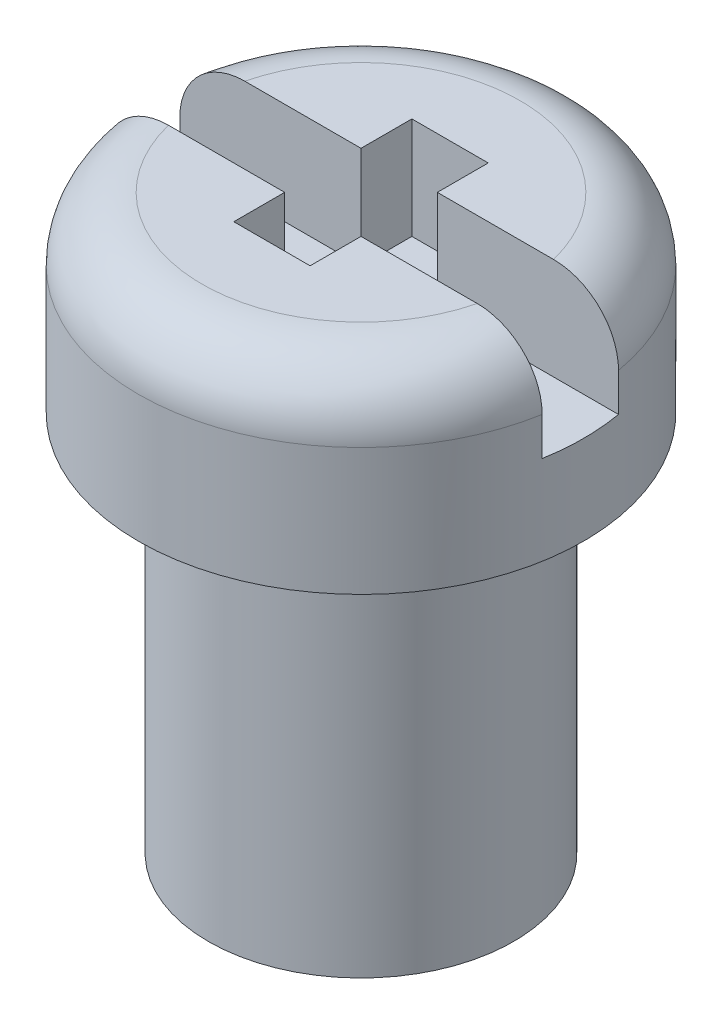
ISO-10303-21;
HEADER;
FILE_DESCRIPTION(('STEP AP214'),'2;1');
FILE_NAME('part.step','',(''),(''),'','','');
FILE_SCHEMA(('AUTOMOTIVE_DESIGN { 1 0 10303 214 1 1 1 1 }'));
ENDSEC;
DATA;
#1=APPLICATION_CONTEXT('core data for automotive mechanical design processes');
#2=APPLICATION_PROTOCOL_DEFINITION('international standard','automotive_design',2000,#1);
#3=PRODUCT_CONTEXT('',#1,'mechanical');
#4=PRODUCT('Part','Part','',(#3));
#5=PRODUCT_RELATED_PRODUCT_CATEGORY('part','',(#4));
#6=PRODUCT_DEFINITION_FORMATION('','',#4);
#7=PRODUCT_DEFINITION_CONTEXT('part definition',#1,'design');
#8=PRODUCT_DEFINITION('design','',#6,#7);
#9=PRODUCT_DEFINITION_SHAPE('','',#8);
#10=(LENGTH_UNIT() NAMED_UNIT(*) SI_UNIT(.MILLI.,.METRE.));
#11=(NAMED_UNIT(*) PLANE_ANGLE_UNIT() SI_UNIT($,.RADIAN.));
#12=(NAMED_UNIT(*) SI_UNIT($,.STERADIAN.) SOLID_ANGLE_UNIT());
#13=UNCERTAINTY_MEASURE_WITH_UNIT(LENGTH_MEASURE(1.E-05),#10,'distance_accuracy_value','');
#14=(GEOMETRIC_REPRESENTATION_CONTEXT(3) GLOBAL_UNCERTAINTY_ASSIGNED_CONTEXT((#13)) GLOBAL_UNIT_ASSIGNED_CONTEXT((#10,
#11,#12)) REPRESENTATION_CONTEXT('',''));
#15=CARTESIAN_POINT('',(0.,0.,0.));
#16=DIRECTION('',(0.,0.,1.));
#17=DIRECTION('',(1.,0.,0.));
#18=AXIS2_PLACEMENT_3D('',#15,#16,#17);
#19=CARTESIAN_POINT('',(11.435,15.43857864376,-7.956));
#20=DIRECTION('',(0.,1.,0.));
#21=DIRECTION('',(0.,0.,1.));
#22=AXIS2_PLACEMENT_3D('',#19,#20,#21);
#23=PLANE('',#22);
#24=DIRECTION('',(-1.,0.,0.));
#25=VECTOR('',#24,1.);
#26=CARTESIAN_POINT('',(13.050906035045,15.43857864376,-7.1));
#27=LINE('',#26,#25);
#28=CARTESIAN_POINT('',(14.475,15.43857864376,-7.09999999999997));
#29=VERTEX_POINT('',#28);
#30=CARTESIAN_POINT('',(11.6268120700878,15.43857864376,-7.1));
#31=VERTEX_POINT('',#30);
#32=EDGE_CURVE('E111',#29,#31,#27,.T.);
#33=ORIENTED_EDGE('',*,*,#32,.T.);
#34=CARTESIAN_POINT('',(15.075,15.43857864376,-6.5));
#35=DIRECTION('',(0.,1.,0.));
#36=DIRECTION('',(0.,0.,1.));
#37=AXIS2_PLACEMENT_3D('',#34,#35,#36);
#38=CIRCLE('',#37,3.5);
#39=CARTESIAN_POINT('',(11.6268120700874,15.43857864376,-5.9));
#40=VERTEX_POINT('',#39);
#41=EDGE_CURVE('E105',#31,#40,#38,.T.);
#42=ORIENTED_EDGE('',*,*,#41,.T.);
#43=DIRECTION('',(1.,0.,0.));
#44=VECTOR('',#43,1.);
#45=CARTESIAN_POINT('',(13.050906035045,15.43857864376,-5.9));
#46=LINE('',#45,#44);
#47=CARTESIAN_POINT('',(14.475,15.43857864376,-5.90000000000006));
#48=VERTEX_POINT('',#47);
#49=EDGE_CURVE('E108',#40,#48,#46,.T.);
#50=ORIENTED_EDGE('',*,*,#49,.T.);
#51=DIRECTION('',(0.,0.,1.));
#52=VECTOR('',#51,1.);
#53=CARTESIAN_POINT('',(14.475,15.43857864376,-5.5));
#54=LINE('',#53,#52);
#55=CARTESIAN_POINT('',(14.475,15.43857864376,-5.09999999999998));
#56=VERTEX_POINT('',#55);
#57=EDGE_CURVE('E152',#48,#56,#54,.T.);
#58=ORIENTED_EDGE('',*,*,#57,.T.);
#59=DIRECTION('',(1.,0.,0.));
#60=VECTOR('',#59,1.);
#61=CARTESIAN_POINT('',(15.075,15.43857864376,-5.1));
#62=LINE('',#61,#60);
#63=CARTESIAN_POINT('',(15.675,15.43857864376,-5.09999999999997));
#64=VERTEX_POINT('',#63);
#65=EDGE_CURVE('E202',#56,#64,#62,.T.);
#66=ORIENTED_EDGE('',*,*,#65,.T.);
#67=DIRECTION('',(0.,0.,-1.));
#68=VECTOR('',#67,1.);
#69=CARTESIAN_POINT('',(15.675,15.43857864376,-5.5));
#70=LINE('',#69,#68);
#71=CARTESIAN_POINT('',(15.675,15.43857864376,-5.90000000000007));
#72=VERTEX_POINT('',#71);
#73=EDGE_CURVE('E191',#64,#72,#70,.T.);
#74=ORIENTED_EDGE('',*,*,#73,.T.);
#75=DIRECTION('',(1.,0.,0.));
#76=VECTOR('',#75,1.);
#77=CARTESIAN_POINT('',(17.099093964955,15.43857864376,-5.9));
#78=LINE('',#77,#76);
#79=CARTESIAN_POINT('',(18.5231879299122,15.43857864376,-5.9));
#80=VERTEX_POINT('',#79);
#81=EDGE_CURVE('E126',#72,#80,#78,.T.);
#82=ORIENTED_EDGE('',*,*,#81,.T.);
#83=CARTESIAN_POINT('',(15.075,15.43857864376,-6.5));
#84=DIRECTION('',(0.,1.,0.));
#85=DIRECTION('',(0.,0.,1.));
#86=AXIS2_PLACEMENT_3D('',#83,#84,#85);
#87=CIRCLE('',#86,3.5);
#88=CARTESIAN_POINT('',(18.5231879299125,15.43857864376,-7.1));
#89=VERTEX_POINT('',#88);
#90=EDGE_CURVE('E20',#80,#89,#87,.T.);
#91=ORIENTED_EDGE('',*,*,#90,.T.);
#92=DIRECTION('',(-1.,0.,0.));
#93=VECTOR('',#92,1.);
#94=CARTESIAN_POINT('',(17.099093964955,15.43857864376,-7.1));
#95=LINE('',#94,#93);
#96=CARTESIAN_POINT('',(15.675,15.43857864376,-7.09999999999996));
#97=VERTEX_POINT('',#96);
#98=EDGE_CURVE('E156',#89,#97,#95,.T.);
#99=ORIENTED_EDGE('',*,*,#98,.T.);
#100=DIRECTION('',(0.,0.,-1.));
#101=VECTOR('',#100,1.);
#102=CARTESIAN_POINT('',(15.675,15.43857864376,-6.5));
#103=LINE('',#102,#101);
#104=CARTESIAN_POINT('',(15.675,15.43857864376,-7.90000000000003));
#105=VERTEX_POINT('',#104);
#106=EDGE_CURVE('E173',#97,#105,#103,.T.);
#107=ORIENTED_EDGE('',*,*,#106,.T.);
#108=DIRECTION('',(-1.,0.,0.));
#109=VECTOR('',#108,1.);
#110=CARTESIAN_POINT('',(15.075,15.43857864376,-7.9));
#111=LINE('',#110,#109);
#112=CARTESIAN_POINT('',(14.475,15.43857864376,-7.9));
#113=VERTEX_POINT('',#112);
#114=EDGE_CURVE('E170',#105,#113,#111,.T.);
#115=ORIENTED_EDGE('',*,*,#114,.T.);
#116=DIRECTION('',(0.,0.,1.));
#117=VECTOR('',#116,1.);
#118=CARTESIAN_POINT('',(14.475,15.43857864376,-6.5));
#119=LINE('',#118,#117);
#120=EDGE_CURVE('E117',#113,#29,#119,.T.);
#121=ORIENTED_EDGE('',*,*,#120,.T.);
#122=EDGE_LOOP('',(#33,#42,#50,#58,#66,#74,#82,#91,#99,#107,#115,#121));
#123=FACE_BOUND('',#122,.T.);
#124=ADVANCED_FACE('F16',(#123),#23,.T.);
#125=CARTESIAN_POINT('',(11.56984831149,15.40657864376,-5.9));
#126=DIRECTION('',(0.,0.,1.));
#127=DIRECTION('',(1.,0.,0.));
#128=AXIS2_PLACEMENT_3D('',#125,#126,#127);
#129=PLANE('',#128);
#130=ORIENTED_EDGE('',*,*,#49,.F.);
#131=DIRECTION('',(0.,-1.,0.));
#132=VECTOR('',#131,1.);
#133=CARTESIAN_POINT('',(11.6268120700882,16.23857864376,-5.9));
#134=LINE('',#133,#132);
#135=CARTESIAN_POINT('',(11.6268120700874,16.03857864376,-5.9));
#136=VERTEX_POINT('',#135);
#137=EDGE_CURVE('E121',#136,#40,#134,.T.);
#138=ORIENTED_EDGE('',*,*,#137,.F.);
#139=CARTESIAN_POINT('',(12.6480677800963,17.03857864376,-5.9));
#140=CARTESIAN_POINT('',(12.5895420814691,17.0386230612065,-5.9));
#141=CARTESIAN_POINT('',(12.5310194945801,17.0337372969009,-5.9));
#142=CARTESIAN_POINT('',(12.415587216186,17.0143129306468,-5.9));
#143=CARTESIAN_POINT('',(12.3586778853953,16.9997721873794,-5.9));
#144=CARTESIAN_POINT('',(12.2480446087088,16.9612240955659,-5.9));
#145=CARTESIAN_POINT('',(12.1943242819711,16.9372062192238,-5.9));
#146=CARTESIAN_POINT('',(12.1174966689575,16.8945991982062,-5.9));
#147=CARTESIAN_POINT('',(12.0925142544198,16.8793012108076,-5.9));
#148=CARTESIAN_POINT('',(12.0439360789731,16.8465906645345,-5.9));
#149=CARTESIAN_POINT('',(12.0203417610094,16.8291759609934,-5.9));
#150=CARTESIAN_POINT('',(11.9528413828041,16.7746538367913,-5.9));
#151=CARTESIAN_POINT('',(11.9111879591809,16.7346948608543,-5.9));
#152=CARTESIAN_POINT('',(11.8353593452245,16.6482234521663,-5.9));
#153=CARTESIAN_POINT('',(11.80118282838,16.6017121842974,-5.9));
#154=CARTESIAN_POINT('',(11.7566170003668,16.5285557984295,-5.9));
#155=CARTESIAN_POINT('',(11.7429731499233,16.5038456545106,-5.9));
#156=CARTESIAN_POINT('',(11.7178484907949,16.4533789493139,-5.9));
#157=CARTESIAN_POINT('',(11.7063657965044,16.427623324297,-5.9));
#158=CARTESIAN_POINT('',(11.6752966977488,16.3490397649066,-5.9));
#159=CARTESIAN_POINT('',(11.6590505315232,16.2948314783461,-5.9));
#160=CARTESIAN_POINT('',(11.6406551642276,16.2066119912148,-5.9));
#161=CARTESIAN_POINT('',(11.6354666697964,16.1731930509288,-5.9));
#162=CARTESIAN_POINT('',(11.6285473052076,16.1060494764975,-5.9));
#163=CARTESIAN_POINT('',(11.6268112925914,16.0723253722789,-5.90000000000002));
#164=CARTESIAN_POINT('',(11.626812070084,16.03857864376,-5.90000000000004));
#165=B_SPLINE_CURVE_WITH_KNOTS('',3,(#139,#140,#141,#142,#143,#144,#145,#146,#147,#148,#149,
#150,#151,#152,#153,#154,#155,#156,#157,#158,#159,#160,#161,#162,#163,#164),.UNSPECIFIED.,.F.,
.F.,(4,2,2,2,2,2,2,2,2,2,2,2,4),(0.,0.175362882315274,0.350764670292272,0.526361856657457,
0.614150494019772,0.702028832546056,0.874296341847614,1.04653326357754,1.13112253781448,
1.21563766238174,1.3844471265291,1.4857490646109,1.58690000048813),.UNSPECIFIED.);
#166=CARTESIAN_POINT('',(12.6480677800963,17.03857864376,-5.8999999999999));
#167=VERTEX_POINT('',#166);
#168=EDGE_CURVE('E116',#167,#136,#165,.T.);
#169=ORIENTED_EDGE('',*,*,#168,.F.);
#170=DIRECTION('',(-1.,0.,0.));
#171=VECTOR('',#170,1.);
#172=CARTESIAN_POINT('',(15.075,17.03857864376,-5.9));
#173=LINE('',#172,#171);
#174=CARTESIAN_POINT('',(14.4749999999997,17.03857864376,-5.90000000000004));
#175=VERTEX_POINT('',#174);
#176=EDGE_CURVE('E226',#175,#167,#173,.T.);
#177=ORIENTED_EDGE('',*,*,#176,.F.);
#178=DIRECTION('',(0.,-1.,0.));
#179=VECTOR('',#178,1.);
#180=CARTESIAN_POINT('',(14.475,16.23857864376,-5.90000000000012));
#181=LINE('',#180,#179);
#182=EDGE_CURVE('E124',#175,#48,#181,.T.);
#183=ORIENTED_EDGE('',*,*,#182,.T.);
#184=EDGE_LOOP('',(#130,#138,#169,#177,#183));
#185=FACE_BOUND('',#184,.T.);
#186=ADVANCED_FACE('F120',(#185),#129,.F.);
#187=CARTESIAN_POINT('',(15.6180362414,15.40657864376,-5.9));
#188=DIRECTION('',(0.,0.,1.));
#189=DIRECTION('',(1.,0.,0.));
#190=AXIS2_PLACEMENT_3D('',#187,#188,#189);
#191=PLANE('',#190);
#192=DIRECTION('',(0.,1.,0.));
#193=VECTOR('',#192,1.);
#194=CARTESIAN_POINT('',(18.523187929911,16.23857864376,-5.9));
#195=LINE('',#194,#193);
#196=CARTESIAN_POINT('',(18.5231879299135,16.03857864376,-5.9));
#197=VERTEX_POINT('',#196);
#198=EDGE_CURVE('E188',#80,#197,#195,.T.);
#199=ORIENTED_EDGE('',*,*,#198,.F.);
#200=ORIENTED_EDGE('',*,*,#81,.F.);
#201=DIRECTION('',(0.,1.,0.));
#202=VECTOR('',#201,1.);
#203=CARTESIAN_POINT('',(15.675,16.23857864376,-5.9000000000001));
#204=LINE('',#203,#202);
#205=CARTESIAN_POINT('',(15.6750000000003,17.03857864376,-5.90000000000003));
#206=VERTEX_POINT('',#205);
#207=EDGE_CURVE('E195',#72,#206,#204,.T.);
#208=ORIENTED_EDGE('',*,*,#207,.T.);
#209=DIRECTION('',(-1.,0.,0.));
#210=VECTOR('',#209,1.);
#211=CARTESIAN_POINT('',(15.075,17.03857864376,-5.9));
#212=LINE('',#211,#210);
#213=CARTESIAN_POINT('',(17.5019322199035,17.03857864376,-5.89999999999977));
#214=VERTEX_POINT('',#213);
#215=EDGE_CURVE('E381',#214,#206,#212,.T.);
#216=ORIENTED_EDGE('',*,*,#215,.F.);
#217=CARTESIAN_POINT('',(18.523187929916,16.03857864376,-5.9));
#218=CARTESIAN_POINT('',(18.5231878866565,16.066383726136,-5.9));
#219=CARTESIAN_POINT('',(18.5220100613491,16.0941753999307,-5.9));
#220=CARTESIAN_POINT('',(18.5173122929455,16.1495581484726,-5.9));
#221=CARTESIAN_POINT('',(18.5137925105113,16.1771492368489,-5.9));
#222=CARTESIAN_POINT('',(18.4997587863754,16.2592576884042,-5.9));
#223=CARTESIAN_POINT('',(18.4857703429067,16.3132222180484,-5.9));
#224=CARTESIAN_POINT('',(18.4489416504953,16.4180302643659,-5.9));
#225=CARTESIAN_POINT('',(18.4260981044165,16.4688726103378,-5.9));
#226=CARTESIAN_POINT('',(18.3722409407059,16.566029907991,-5.9));
#227=CARTESIAN_POINT('',(18.3412279702725,16.6123452179151,-5.9));
#228=CARTESIAN_POINT('',(18.2717738439858,16.6994050738873,-5.9));
#229=CARTESIAN_POINT('',(18.2332949095687,16.740119407612,-5.9));
#230=CARTESIAN_POINT('',(18.15010451577,16.8146324704767,-5.9));
#231=CARTESIAN_POINT('',(18.1053923118572,16.8484303722934,-5.9));
#232=CARTESIAN_POINT('',(18.034327296152,16.89348561241,-5.9));
#233=CARTESIAN_POINT('',(18.009770681158,16.9076492262838,-5.9));
#234=CARTESIAN_POINT('',(17.9595926511625,16.9338811474115,-5.9));
#235=CARTESIAN_POINT('',(17.9339722237027,16.9459513463792,-5.9));
#236=CARTESIAN_POINT('',(17.8557332185836,16.9789276980628,-5.9));
#237=CARTESIAN_POINT('',(17.8017093377088,16.9966170224667,-5.9));
#238=CARTESIAN_POINT('',(17.7065741100677,17.0193883927237,-5.9));
#239=CARTESIAN_POINT('',(17.6659475328273,17.0265909051309,-5.9));
#240=CARTESIAN_POINT('',(17.5841968294739,17.036184754955,-5.9));
#241=CARTESIAN_POINT('',(17.5430736254465,17.0385839393081,-5.9));
#242=CARTESIAN_POINT('',(17.5019322199035,17.03857864376,-5.9));
#243=B_SPLINE_CURVE_WITH_KNOTS('',3,(#217,#218,#219,#220,#221,#222,#223,#224,#225,#226,#227,
#228,#229,#230,#231,#232,#233,#234,#235,#236,#237,#238,#239,#240,#241,#242),.UNSPECIFIED.,.F.,
.F.,(4,2,2,2,2,2,2,2,2,2,2,2,4),(0.,0.0833637177422799,0.166721717196908,0.3331060743507,
0.499552443166076,0.665985629725807,0.833284048459024,1.00060246725285,1.08556236795066,
1.17044509005407,1.34011384837159,1.46363192180924,1.5869480452866),.UNSPECIFIED.);
#244=EDGE_CURVE('E196',#197,#214,#243,.T.);
#245=ORIENTED_EDGE('',*,*,#244,.F.);
#246=EDGE_LOOP('',(#199,#200,#208,#216,#245));
#247=FACE_BOUND('',#246,.T.);
#248=ADVANCED_FACE('F453',(#247),#191,.F.);
#249=CARTESIAN_POINT('',(15.675,15.40657864376,-5.083942066319));
#250=DIRECTION('',(1.,0.,0.));
#251=DIRECTION('',(0.,0.,-1.));
#252=AXIS2_PLACEMENT_3D('',#249,#250,#251);
#253=PLANE('',#252);
#254=ORIENTED_EDGE('',*,*,#73,.F.);
#255=DIRECTION('',(0.,1.,0.));
#256=VECTOR('',#255,1.);
#257=CARTESIAN_POINT('',(15.675,16.23857864376,-5.1));
#258=LINE('',#257,#256);
#259=CARTESIAN_POINT('',(15.6750000000001,17.03857864376,-5.09999999999994));
#260=VERTEX_POINT('',#259);
#261=EDGE_CURVE('E153',#64,#260,#258,.T.);
#262=ORIENTED_EDGE('',*,*,#261,.T.);
#263=DIRECTION('',(0.,0.,1.));
#264=VECTOR('',#263,1.);
#265=CARTESIAN_POINT('',(15.6750000000005,17.03857864376,-6.5));
#266=LINE('',#265,#264);
#267=EDGE_CURVE('E380',#206,#260,#266,.T.);
#268=ORIENTED_EDGE('',*,*,#267,.F.);
#269=ORIENTED_EDGE('',*,*,#207,.F.);
#270=EDGE_LOOP('',(#254,#262,#268,#269));
#271=FACE_BOUND('',#270,.T.);
#272=ADVANCED_FACE('F442',(#271),#253,.F.);
#273=CARTESIAN_POINT('',(14.451,15.40657864376,-5.1));
#274=DIRECTION('',(0.,0.,1.));
#275=DIRECTION('',(1.,0.,0.));
#276=AXIS2_PLACEMENT_3D('',#273,#274,#275);
#277=PLANE('',#276);
#278=ORIENTED_EDGE('',*,*,#65,.F.);
#279=DIRECTION('',(0.,1.,0.));
#280=VECTOR('',#279,1.);
#281=CARTESIAN_POINT('',(14.475,16.23857864376,-5.0999999999999));
#282=LINE('',#281,#280);
#283=CARTESIAN_POINT('',(14.4749999999999,17.03857864376,-5.09999999999998));
#284=VERTEX_POINT('',#283);
#285=EDGE_CURVE('E182',#56,#284,#282,.T.);
#286=ORIENTED_EDGE('',*,*,#285,.T.);
#287=DIRECTION('',(-1.,0.,0.));
#288=VECTOR('',#287,1.);
#289=CARTESIAN_POINT('',(15.075,17.03857864376,-5.1));
#290=LINE('',#289,#288);
#291=EDGE_CURVE('E147',#260,#284,#290,.T.);
#292=ORIENTED_EDGE('',*,*,#291,.F.);
#293=ORIENTED_EDGE('',*,*,#261,.F.);
#294=EDGE_LOOP('',(#278,#286,#292,#293));
#295=FACE_BOUND('',#294,.T.);
#296=ADVANCED_FACE('F445',(#295),#277,.F.);
#297=CARTESIAN_POINT('',(14.475,15.40657864376,-5.916057933681));
#298=DIRECTION('',(-1.,0.,0.));
#299=DIRECTION('',(0.,0.,1.));
#300=AXIS2_PLACEMENT_3D('',#297,#298,#299);
#301=PLANE('',#300);
#302=ORIENTED_EDGE('',*,*,#57,.F.);
#303=ORIENTED_EDGE('',*,*,#182,.F.);
#304=DIRECTION('',(0.,0.,-1.));
#305=VECTOR('',#304,1.);
#306=CARTESIAN_POINT('',(14.4749999999995,17.03857864376,-6.5));
#307=LINE('',#306,#305);
#308=EDGE_CURVE('E142',#284,#175,#307,.T.);
#309=ORIENTED_EDGE('',*,*,#308,.F.);
#310=ORIENTED_EDGE('',*,*,#285,.F.);
#311=EDGE_LOOP('',(#302,#303,#309,#310));
#312=FACE_BOUND('',#311,.T.);
#313=ADVANCED_FACE('F451',(#312),#301,.F.);
#314=CARTESIAN_POINT('',(18.58015168851,15.40657864376,-7.1));
#315=DIRECTION('',(0.,0.,-1.));
#316=DIRECTION('',(-1.,0.,0.));
#317=AXIS2_PLACEMENT_3D('',#314,#315,#316);
#318=PLANE('',#317);
#319=ORIENTED_EDGE('',*,*,#98,.F.);
#320=DIRECTION('',(0.,-1.,0.));
#321=VECTOR('',#320,1.);
#322=CARTESIAN_POINT('',(18.5231879299117,16.23857864376,-7.1));
#323=LINE('',#322,#321);
#324=CARTESIAN_POINT('',(18.5231879299125,16.03857864376,-7.1));
#325=VERTEX_POINT('',#324);
#326=EDGE_CURVE('E160',#325,#89,#323,.T.);
#327=ORIENTED_EDGE('',*,*,#326,.F.);
#328=CARTESIAN_POINT('',(17.5019322199037,17.03857864376,-7.1));
#329=CARTESIAN_POINT('',(17.5604579185309,17.0386230612065,-7.1));
#330=CARTESIAN_POINT('',(17.6189805054199,17.0337372969009,-7.1));
#331=CARTESIAN_POINT('',(17.734412783814,17.0143129306468,-7.1));
#332=CARTESIAN_POINT('',(17.7913221146047,16.9997721873794,-7.1));
#333=CARTESIAN_POINT('',(17.9019553912912,16.9612240955659,-7.1));
#334=CARTESIAN_POINT('',(17.9556757180289,16.9372062192238,-7.1));
#335=CARTESIAN_POINT('',(18.0325033310425,16.8945991982063,-7.1));
#336=CARTESIAN_POINT('',(18.0574857455801,16.8793012108076,-7.1));
#337=CARTESIAN_POINT('',(18.1060639210269,16.8465906645346,-7.1));
#338=CARTESIAN_POINT('',(18.1296582389906,16.8291759609934,-7.1));
#339=CARTESIAN_POINT('',(18.1971586171959,16.7746538367913,-7.1));
#340=CARTESIAN_POINT('',(18.238812040819,16.7346948608544,-7.1));
#341=CARTESIAN_POINT('',(18.3146406547755,16.6482234521663,-7.1));
#342=CARTESIAN_POINT('',(18.3488171716199,16.6017121842974,-7.1));
#343=CARTESIAN_POINT('',(18.3933829996332,16.5285557984295,-7.1));
#344=CARTESIAN_POINT('',(18.4070268500766,16.5038456545106,-7.1));
#345=CARTESIAN_POINT('',(18.4321515092051,16.4533789493139,-7.1));
#346=CARTESIAN_POINT('',(18.4436342034956,16.427623324297,-7.1));
#347=CARTESIAN_POINT('',(18.4747033022512,16.3490397649067,-7.1));
#348=CARTESIAN_POINT('',(18.4909494684768,16.2948314783461,-7.1));
#349=CARTESIAN_POINT('',(18.5093448357724,16.2066119912148,-7.1));
#350=CARTESIAN_POINT('',(18.5145333302036,16.1731930509288,-7.1));
#351=CARTESIAN_POINT('',(18.5214526947924,16.1060494764976,-7.1));
#352=CARTESIAN_POINT('',(18.5231887074087,16.0723253722789,-7.09999999999998));
#353=CARTESIAN_POINT('',(18.523187929916,16.03857864376,-7.09999999999996));
#354=B_SPLINE_CURVE_WITH_KNOTS('',3,(#328,#329,#330,#331,#332,#333,#334,#335,#336,#337,#338,
#339,#340,#341,#342,#343,#344,#345,#346,#347,#348,#349,#350,#351,#352,#353),.UNSPECIFIED.,.F.,
.F.,(4,2,2,2,2,2,2,2,2,2,2,2,4),(0.,0.175362882315272,0.350764670292274,0.526361856657455,
0.614150494019774,0.702028832546054,0.874296341847615,1.04653326357754,1.13112253781448,
1.21563766238175,1.3844471265291,1.48574906461092,1.58690000048815),.UNSPECIFIED.);
#355=CARTESIAN_POINT('',(17.5019322199037,17.03857864376,-7.1000000000001));
#356=VERTEX_POINT('',#355);
#357=EDGE_CURVE('E284',#356,#325,#354,.T.);
#358=ORIENTED_EDGE('',*,*,#357,.F.);
#359=DIRECTION('',(1.,0.,0.));
#360=VECTOR('',#359,1.);
#361=CARTESIAN_POINT('',(15.075,17.03857864376,-7.1));
#362=LINE('',#361,#360);
#363=CARTESIAN_POINT('',(15.6750000000003,17.03857864376,-7.09999999999996));
#364=VERTEX_POINT('',#363);
#365=EDGE_CURVE('E146',#364,#356,#362,.T.);
#366=ORIENTED_EDGE('',*,*,#365,.F.);
#367=DIRECTION('',(0.,-1.,0.));
#368=VECTOR('',#367,1.);
#369=CARTESIAN_POINT('',(15.675,16.23857864376,-7.09999999999988));
#370=LINE('',#369,#368);
#371=EDGE_CURVE('E214',#364,#97,#370,.T.);
#372=ORIENTED_EDGE('',*,*,#371,.T.);
#373=EDGE_LOOP('',(#319,#327,#358,#366,#372));
#374=FACE_BOUND('',#373,.T.);
#375=ADVANCED_FACE('F297',(#374),#318,.F.);
#376=CARTESIAN_POINT('',(14.5319637586,15.40657864376,-7.1));
#377=DIRECTION('',(0.,0.,-1.));
#378=DIRECTION('',(-1.,0.,0.));
#379=AXIS2_PLACEMENT_3D('',#376,#377,#378);
#380=PLANE('',#379);
#381=DIRECTION('',(0.,1.,0.));
#382=VECTOR('',#381,1.);
#383=CARTESIAN_POINT('',(11.626812070089,16.23857864376,-7.1));
#384=LINE('',#383,#382);
#385=CARTESIAN_POINT('',(11.6268120700865,16.03857864376,-7.1));
#386=VERTEX_POINT('',#385);
#387=EDGE_CURVE('E165',#31,#386,#384,.T.);
#388=ORIENTED_EDGE('',*,*,#387,.F.);
#389=ORIENTED_EDGE('',*,*,#32,.F.);
#390=DIRECTION('',(0.,1.,0.));
#391=VECTOR('',#390,1.);
#392=CARTESIAN_POINT('',(14.475,16.23857864376,-7.0999999999999));
#393=LINE('',#392,#391);
#394=CARTESIAN_POINT('',(14.4749999999997,17.03857864376,-7.09999999999997));
#395=VERTEX_POINT('',#394);
#396=EDGE_CURVE('E215',#29,#395,#393,.T.);
#397=ORIENTED_EDGE('',*,*,#396,.T.);
#398=DIRECTION('',(1.,0.,0.));
#399=VECTOR('',#398,1.);
#400=CARTESIAN_POINT('',(15.075,17.03857864376,-7.1));
#401=LINE('',#400,#399);
#402=CARTESIAN_POINT('',(12.6480677800965,17.03857864376,-7.10000000000023));
#403=VERTEX_POINT('',#402);
#404=EDGE_CURVE('E357',#403,#395,#401,.T.);
#405=ORIENTED_EDGE('',*,*,#404,.F.);
#406=CARTESIAN_POINT('',(11.626812070084,16.03857864376,-7.1));
#407=CARTESIAN_POINT('',(11.6268121133435,16.066383726136,-7.1));
#408=CARTESIAN_POINT('',(11.6279899386509,16.0941753999307,-7.1));
#409=CARTESIAN_POINT('',(11.6326877070545,16.1495581484726,-7.1));
#410=CARTESIAN_POINT('',(11.6362074894887,16.1771492368489,-7.1));
#411=CARTESIAN_POINT('',(11.6502412136246,16.2592576884042,-7.1));
#412=CARTESIAN_POINT('',(11.6642296570933,16.3132222180484,-7.1));
#413=CARTESIAN_POINT('',(11.7010583495047,16.4180302643659,-7.1));
#414=CARTESIAN_POINT('',(11.7239018955834,16.4688726103378,-7.1));
#415=CARTESIAN_POINT('',(11.7777590592941,16.566029907991,-7.1));
#416=CARTESIAN_POINT('',(11.8087720297275,16.6123452179151,-7.1));
#417=CARTESIAN_POINT('',(11.8782261560142,16.6994050738873,-7.1));
#418=CARTESIAN_POINT('',(11.9167050904313,16.740119407612,-7.1));
#419=CARTESIAN_POINT('',(11.99989548423,16.8146324704767,-7.1));
#420=CARTESIAN_POINT('',(12.0446076881428,16.8484303722934,-7.1));
#421=CARTESIAN_POINT('',(12.115672703848,16.89348561241,-7.1));
#422=CARTESIAN_POINT('',(12.140229318842,16.9076492262838,-7.1));
#423=CARTESIAN_POINT('',(12.1904073488375,16.9338811474115,-7.1));
#424=CARTESIAN_POINT('',(12.2160277762973,16.9459513463792,-7.1));
#425=CARTESIAN_POINT('',(12.2942667814164,16.9789276980628,-7.1));
#426=CARTESIAN_POINT('',(12.3482906622912,16.9966170224667,-7.1));
#427=CARTESIAN_POINT('',(12.4434258899323,17.0193883927237,-7.1));
#428=CARTESIAN_POINT('',(12.4840524671727,17.0265909051309,-7.1));
#429=CARTESIAN_POINT('',(12.5658031705261,17.036184754955,-7.1));
#430=CARTESIAN_POINT('',(12.6069263745535,17.0385839393081,-7.1));
#431=CARTESIAN_POINT('',(12.6480677800965,17.03857864376,-7.1));
#432=B_SPLINE_CURVE_WITH_KNOTS('',3,(#406,#407,#408,#409,#410,#411,#412,#413,#414,#415,#416,
#417,#418,#419,#420,#421,#422,#423,#424,#425,#426,#427,#428,#429,#430,#431),.UNSPECIFIED.,.F.,
.F.,(4,2,2,2,2,2,2,2,2,2,2,2,4),(0.,0.0833637177422763,0.166721717196905,0.3331060743507,
0.499552443166077,0.665985629725808,0.833284048459024,1.00060246725285,1.08556236795066,
1.17044509005407,1.34011384837159,1.46363192180924,1.5869480452866),.UNSPECIFIED.);
#433=EDGE_CURVE('E36',#386,#403,#432,.T.);
#434=ORIENTED_EDGE('',*,*,#433,.F.);
#435=EDGE_LOOP('',(#388,#389,#397,#405,#434));
#436=FACE_BOUND('',#435,.T.);
#437=ADVANCED_FACE('F291',(#436),#380,.F.);
#438=CARTESIAN_POINT('',(14.475,15.40657864376,-7.916057933681));
#439=DIRECTION('',(-1.,0.,0.));
#440=DIRECTION('',(0.,0.,1.));
#441=AXIS2_PLACEMENT_3D('',#438,#439,#440);
#442=PLANE('',#441);
#443=ORIENTED_EDGE('',*,*,#120,.F.);
#444=DIRECTION('',(0.,1.,0.));
#445=VECTOR('',#444,1.);
#446=CARTESIAN_POINT('',(14.475,16.23857864376,-7.9));
#447=LINE('',#446,#445);
#448=CARTESIAN_POINT('',(14.4749999999999,17.03857864376,-7.90000000000006));
#449=VERTEX_POINT('',#448);
#450=EDGE_CURVE('E210',#113,#449,#447,.T.);
#451=ORIENTED_EDGE('',*,*,#450,.T.);
#452=DIRECTION('',(0.,0.,-1.));
#453=VECTOR('',#452,1.);
#454=CARTESIAN_POINT('',(14.4749999999995,17.03857864376,-6.5));
#455=LINE('',#454,#453);
#456=EDGE_CURVE('E356',#395,#449,#455,.T.);
#457=ORIENTED_EDGE('',*,*,#456,.F.);
#458=ORIENTED_EDGE('',*,*,#396,.F.);
#459=EDGE_LOOP('',(#443,#451,#457,#458));
#460=FACE_BOUND('',#459,.T.);
#461=ADVANCED_FACE('F296',(#460),#442,.F.);
#462=CARTESIAN_POINT('',(15.699,15.40657864376,-7.9));
#463=DIRECTION('',(0.,0.,-1.));
#464=DIRECTION('',(-1.,0.,0.));
#465=AXIS2_PLACEMENT_3D('',#462,#463,#464);
#466=PLANE('',#465);
#467=ORIENTED_EDGE('',*,*,#114,.F.);
#468=DIRECTION('',(0.,1.,0.));
#469=VECTOR('',#468,1.);
#470=CARTESIAN_POINT('',(15.675,16.23857864376,-7.9000000000001));
#471=LINE('',#470,#469);
#472=CARTESIAN_POINT('',(15.6750000000001,17.03857864376,-7.90000000000003));
#473=VERTEX_POINT('',#472);
#474=EDGE_CURVE('E222',#105,#473,#471,.T.);
#475=ORIENTED_EDGE('',*,*,#474,.T.);
#476=DIRECTION('',(1.,0.,0.));
#477=VECTOR('',#476,1.);
#478=CARTESIAN_POINT('',(15.075,17.03857864376,-7.9));
#479=LINE('',#478,#477);
#480=EDGE_CURVE('E351',#449,#473,#479,.T.);
#481=ORIENTED_EDGE('',*,*,#480,.F.);
#482=ORIENTED_EDGE('',*,*,#450,.F.);
#483=EDGE_LOOP('',(#467,#475,#481,#482));
#484=FACE_BOUND('',#483,.T.);
#485=ADVANCED_FACE('F302',(#484),#466,.F.);
#486=CARTESIAN_POINT('',(15.675,15.40657864376,-7.083942066319));
#487=DIRECTION('',(1.,0.,0.));
#488=DIRECTION('',(0.,0.,-1.));
#489=AXIS2_PLACEMENT_3D('',#486,#487,#488);
#490=PLANE('',#489);
#491=ORIENTED_EDGE('',*,*,#106,.F.);
#492=ORIENTED_EDGE('',*,*,#371,.F.);
#493=DIRECTION('',(0.,0.,1.));
#494=VECTOR('',#493,1.);
#495=CARTESIAN_POINT('',(15.6750000000005,17.03857864376,-6.5));
#496=LINE('',#495,#494);
#497=EDGE_CURVE('E355',#473,#364,#496,.T.);
#498=ORIENTED_EDGE('',*,*,#497,.F.);
#499=ORIENTED_EDGE('',*,*,#474,.F.);
#500=EDGE_LOOP('',(#491,#492,#498,#499));
#501=FACE_BOUND('',#500,.T.);
#502=ADVANCED_FACE('F252',(#501),#490,.F.);
#503=CARTESIAN_POINT('',(17.5990095087,17.03857864376,-9.102330669933));
#504=DIRECTION('',(0.,1.,0.));
#505=DIRECTION('',(-1.,0.,0.));
#506=AXIS2_PLACEMENT_3D('',#503,#504,#505);
#507=PLANE('',#506);
#508=ORIENTED_EDGE('',*,*,#291,.T.);
#509=ORIENTED_EDGE('',*,*,#308,.T.);
#510=ORIENTED_EDGE('',*,*,#176,.T.);
#511=CARTESIAN_POINT('',(15.075,17.03857864376,-6.5));
#512=DIRECTION('',(0.,-1.,0.));
#513=DIRECTION('',(0.970772887960927,0.,0.240000000000002));
#514=AXIS2_PLACEMENT_3D('',#511,#512,#513);
#515=CIRCLE('',#514,2.50000000000242);
#516=EDGE_CURVE('E234',#167,#214,#515,.F.);
#517=ORIENTED_EDGE('',*,*,#516,.T.);
#518=ORIENTED_EDGE('',*,*,#215,.T.);
#519=ORIENTED_EDGE('',*,*,#267,.T.);
#520=EDGE_LOOP('',(#508,#509,#510,#517,#518,#519));
#521=FACE_BOUND('',#520,.T.);
#522=ADVANCED_FACE('F241',(#521),#507,.T.);
#523=CARTESIAN_POINT('',(17.5990095087,17.03857864376,-9.102330669933));
#524=DIRECTION('',(0.,1.,0.));
#525=DIRECTION('',(-1.,0.,0.));
#526=AXIS2_PLACEMENT_3D('',#523,#524,#525);
#527=PLANE('',#526);
#528=ORIENTED_EDGE('',*,*,#480,.T.);
#529=ORIENTED_EDGE('',*,*,#497,.T.);
#530=ORIENTED_EDGE('',*,*,#365,.T.);
#531=CARTESIAN_POINT('',(15.075,17.03857864376,-6.5));
#532=DIRECTION('',(0.,-1.,0.));
#533=DIRECTION('',(-0.970772887960927,0.,-0.240000000000002));
#534=AXIS2_PLACEMENT_3D('',#531,#532,#533);
#535=CIRCLE('',#534,2.50000000000242);
#536=EDGE_CURVE('E350',#356,#403,#535,.F.);
#537=ORIENTED_EDGE('',*,*,#536,.T.);
#538=ORIENTED_EDGE('',*,*,#404,.T.);
#539=ORIENTED_EDGE('',*,*,#456,.T.);
#540=EDGE_LOOP('',(#528,#529,#530,#537,#538,#539));
#541=FACE_BOUND('',#540,.T.);
#542=ADVANCED_FACE('F251',(#541),#527,.T.);
#543=CARTESIAN_POINT('',(15.075,16.03857864376,-6.5));
#544=DIRECTION('',(0.,1.,0.));
#545=DIRECTION('',(-0.999982719882954,0.,-0.00587876989599371));
#546=AXIS2_PLACEMENT_3D('',#543,#544,#545);
#547=TOROIDAL_SURFACE('',#546,2.50000000000262,1.);
#548=ORIENTED_EDGE('',*,*,#244,.T.);
#549=ORIENTED_EDGE('',*,*,#516,.F.);
#550=ORIENTED_EDGE('',*,*,#168,.T.);
#551=CARTESIAN_POINT('',(15.075,16.0385786437599,-6.5));
#552=DIRECTION('',(0.,1.,0.));
#553=DIRECTION('',(-1.,0.,0.));
#554=AXIS2_PLACEMENT_3D('',#551,#552,#553);
#555=CIRCLE('',#554,3.5);
#556=EDGE_CURVE('E130',#136,#197,#555,.T.);
#557=ORIENTED_EDGE('',*,*,#556,.T.);
#558=EDGE_LOOP('',(#548,#549,#550,#557));
#559=FACE_BOUND('',#558,.T.);
#560=ADVANCED_FACE('F256',(#559),#547,.T.);
#561=CARTESIAN_POINT('',(15.075,16.03857864376,-6.5));
#562=DIRECTION('',(0.,1.,0.));
#563=DIRECTION('',(0.999982719882954,0.,0.00587876989599371));
#564=AXIS2_PLACEMENT_3D('',#561,#562,#563);
#565=TOROIDAL_SURFACE('',#564,2.50000000000262,1.);
#566=ORIENTED_EDGE('',*,*,#433,.T.);
#567=ORIENTED_EDGE('',*,*,#536,.F.);
#568=ORIENTED_EDGE('',*,*,#357,.T.);
#569=CARTESIAN_POINT('',(15.075,16.0385786437599,-6.5));
#570=DIRECTION('',(0.,1.,0.));
#571=DIRECTION('',(-1.,0.,0.));
#572=AXIS2_PLACEMENT_3D('',#569,#570,#571);
#573=CIRCLE('',#572,3.5);
#574=EDGE_CURVE('E274',#325,#386,#573,.T.);
#575=ORIENTED_EDGE('',*,*,#574,.T.);
#576=EDGE_LOOP('',(#566,#567,#568,#575));
#577=FACE_BOUND('',#576,.T.);
#578=ADVANCED_FACE('F286',(#577),#565,.T.);
#579=CARTESIAN_POINT('',(15.075,14.03857864376,-6.5));
#580=DIRECTION('',(0.,1.,0.));
#581=DIRECTION('',(0.,0.,1.));
#582=AXIS2_PLACEMENT_3D('',#579,#580,#581);
#583=CYLINDRICAL_SURFACE('',#582,3.5);
#584=CARTESIAN_POINT('',(15.075,14.03857864376,-6.5));
#585=DIRECTION('',(0.,1.,0.));
#586=DIRECTION('',(0.,0.,1.));
#587=AXIS2_PLACEMENT_3D('',#584,#585,#586);
#588=CIRCLE('',#587,3.5);
#589=CARTESIAN_POINT('',(15.075,14.03857864376,-3.));
#590=VERTEX_POINT('',#589);
#591=EDGE_CURVE('E270',#590,#590,#588,.T.);
#592=ORIENTED_EDGE('',*,*,#591,.T.);
#593=EDGE_LOOP('',(#592));
#594=FACE_BOUND('',#593,.T.);
#595=ORIENTED_EDGE('',*,*,#137,.T.);
#596=ORIENTED_EDGE('',*,*,#41,.F.);
#597=ORIENTED_EDGE('',*,*,#387,.T.);
#598=ORIENTED_EDGE('',*,*,#574,.F.);
#599=ORIENTED_EDGE('',*,*,#326,.T.);
#600=ORIENTED_EDGE('',*,*,#90,.F.);
#601=ORIENTED_EDGE('',*,*,#198,.T.);
#602=ORIENTED_EDGE('',*,*,#556,.F.);
#603=EDGE_LOOP('',(#595,#596,#597,#598,#599,#600,#601,#602));
#604=FACE_BOUND('',#603,.T.);
#605=ADVANCED_FACE('F128',(#594,#604),#583,.T.);
#606=CARTESIAN_POINT('',(18.715,14.03857864376,-10.14250715897));
#607=DIRECTION('',(0.,1.,0.));
#608=DIRECTION('',(-1.,0.,0.));
#609=AXIS2_PLACEMENT_3D('',#606,#607,#608);
#610=PLANE('',#609);
#611=CARTESIAN_POINT('',(15.075,14.0385786437599,-6.5));
#612=DIRECTION('',(0.,1.,0.));
#613=DIRECTION('',(0.,0.,1.));
#614=AXIS2_PLACEMENT_3D('',#611,#612,#613);
#615=CIRCLE('',#614,2.4);
#616=CARTESIAN_POINT('',(15.075,14.0385786437599,-4.1));
#617=VERTEX_POINT('',#616);
#618=EDGE_CURVE('E27',#617,#617,#615,.T.);
#619=ORIENTED_EDGE('',*,*,#618,.T.);
#620=EDGE_LOOP('',(#619));
#621=FACE_BOUND('',#620,.T.);
#622=ORIENTED_EDGE('',*,*,#591,.F.);
#623=EDGE_LOOP('',(#622));
#624=FACE_BOUND('',#623,.T.);
#625=ADVANCED_FACE('F258',(#621,#624),#610,.F.);
#626=CARTESIAN_POINT('',(15.075,8.03857864376295,-6.5));
#627=DIRECTION('',(0.,1.,0.));
#628=DIRECTION('',(0.,0.,1.));
#629=AXIS2_PLACEMENT_3D('',#626,#627,#628);
#630=CYLINDRICAL_SURFACE('',#629,2.4);
#631=CARTESIAN_POINT('',(15.075,8.03857864376295,-6.5));
#632=DIRECTION('',(0.,1.,0.));
#633=DIRECTION('',(0.,0.,1.));
#634=AXIS2_PLACEMENT_3D('',#631,#632,#633);
#635=CIRCLE('',#634,2.4);
#636=CARTESIAN_POINT('',(15.075,8.03857864376295,-4.1));
#637=VERTEX_POINT('',#636);
#638=EDGE_CURVE('E10',#637,#637,#635,.T.);
#639=ORIENTED_EDGE('',*,*,#638,.T.);
#640=EDGE_LOOP('',(#639));
#641=FACE_BOUND('',#640,.T.);
#642=ORIENTED_EDGE('',*,*,#618,.F.);
#643=EDGE_LOOP('',(#642));
#644=FACE_BOUND('',#643,.T.);
#645=ADVANCED_FACE('F313',(#641,#644),#630,.T.);
#646=CARTESIAN_POINT('',(17.571,8.038578643763,-8.996));
#647=DIRECTION('',(0.,1.,0.));
#648=DIRECTION('',(-1.,0.,0.));
#649=AXIS2_PLACEMENT_3D('',#646,#647,#648);
#650=PLANE('',#649);
#651=ORIENTED_EDGE('',*,*,#638,.F.);
#652=EDGE_LOOP('',(#651));
#653=FACE_BOUND('',#652,.T.);
#654=ADVANCED_FACE('F18',(#653),#650,.F.);
#655=CLOSED_SHELL('',(#124,#186,#248,#272,#296,#313,#375,#437,#461,#485,#502,#522,#542,#560,
#578,#605,#625,#645,#654));
#656=MANIFOLD_SOLID_BREP('B1',#655);
#657=ADVANCED_BREP_SHAPE_REPRESENTATION('',(#18,#656),#14);
#658=SHAPE_DEFINITION_REPRESENTATION(#9,#657);
ENDSEC;
END-ISO-10303-21;
